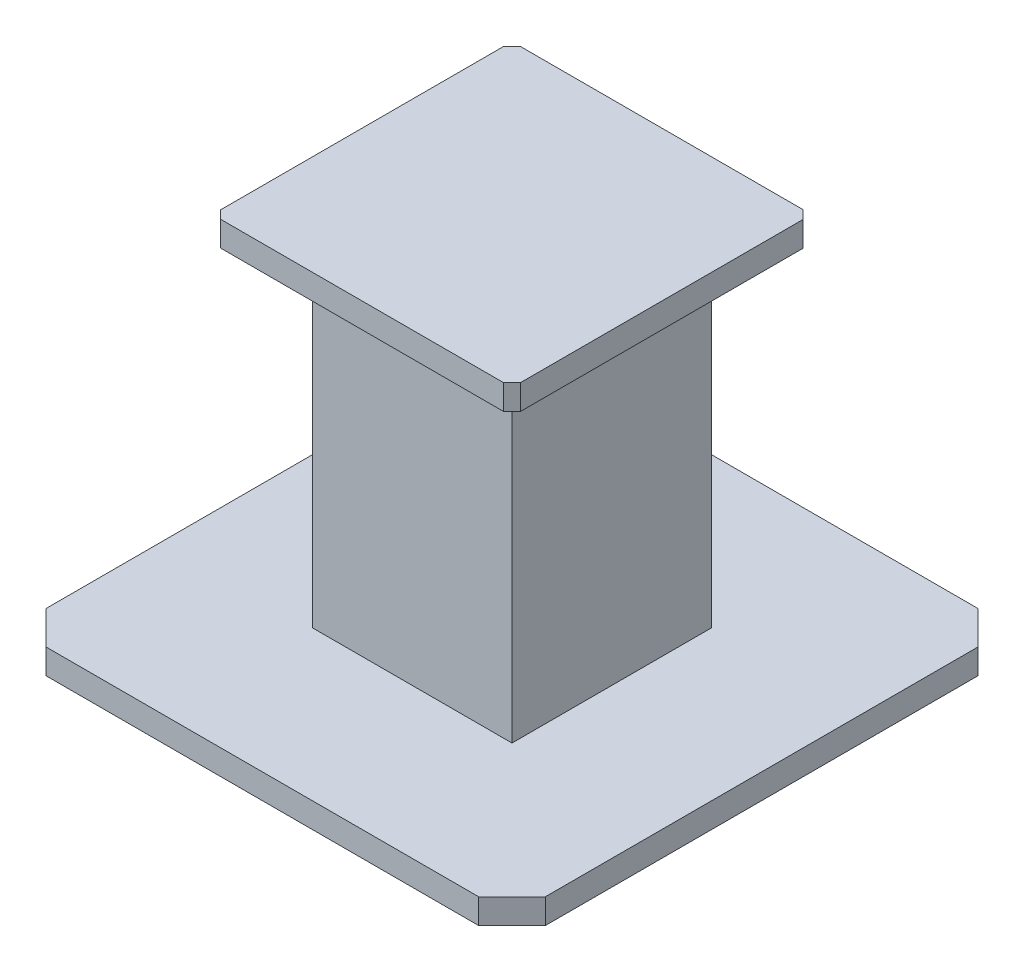
ISO-10303-21;
HEADER;
FILE_DESCRIPTION(('STEP AP214'),'2;1');
FILE_NAME('part.step','',(''),(''),'','','');
FILE_SCHEMA(('AUTOMOTIVE_DESIGN { 1 0 10303 214 1 1 1 1 }'));
ENDSEC;
DATA;
#1=APPLICATION_CONTEXT('core data for automotive mechanical design processes');
#2=APPLICATION_PROTOCOL_DEFINITION('international standard','automotive_design',2000,#1);
#3=PRODUCT_CONTEXT('',#1,'mechanical');
#4=PRODUCT('Part','Part','',(#3));
#5=PRODUCT_RELATED_PRODUCT_CATEGORY('part','',(#4));
#6=PRODUCT_DEFINITION_FORMATION('','',#4);
#7=PRODUCT_DEFINITION_CONTEXT('part definition',#1,'design');
#8=PRODUCT_DEFINITION('design','',#6,#7);
#9=PRODUCT_DEFINITION_SHAPE('','',#8);
#10=(LENGTH_UNIT() NAMED_UNIT(*) SI_UNIT(.MILLI.,.METRE.));
#11=(NAMED_UNIT(*) PLANE_ANGLE_UNIT() SI_UNIT($,.RADIAN.));
#12=(NAMED_UNIT(*) SI_UNIT($,.STERADIAN.) SOLID_ANGLE_UNIT());
#13=UNCERTAINTY_MEASURE_WITH_UNIT(LENGTH_MEASURE(1.E-05),#10,'distance_accuracy_value','');
#14=(GEOMETRIC_REPRESENTATION_CONTEXT(3) GLOBAL_UNCERTAINTY_ASSIGNED_CONTEXT((#13)) GLOBAL_UNIT_ASSIGNED_CONTEXT((#10,
#11,#12)) REPRESENTATION_CONTEXT('',''));
#15=CARTESIAN_POINT('',(0.,0.,0.));
#16=DIRECTION('',(0.,0.,1.));
#17=DIRECTION('',(1.,0.,0.));
#18=AXIS2_PLACEMENT_3D('',#15,#16,#17);
#19=CARTESIAN_POINT('',(0.,0.,0.));
#20=DIRECTION('',(0.,1.,0.));
#21=DIRECTION('',(0.,0.,1.));
#22=AXIS2_PLACEMENT_3D('',#19,#20,#21);
#23=PLANE('',#22);
#24=DIRECTION('',(0.,0.,1.));
#25=VECTOR('',#24,1.);
#26=CARTESIAN_POINT('',(-90.,0.,90.));
#27=LINE('',#26,#25);
#28=CARTESIAN_POINT('',(-90.,0.,-85.));
#29=VERTEX_POINT('',#28);
#30=CARTESIAN_POINT('',(-90.,0.,85.0000000000001));
#31=VERTEX_POINT('',#30);
#32=EDGE_CURVE('E218',#29,#31,#27,.T.);
#33=ORIENTED_EDGE('',*,*,#32,.F.);
#34=DIRECTION('',(-0.707106781186548,0.,0.707106781186548));
#35=VECTOR('',#34,1.);
#36=CARTESIAN_POINT('',(-90.,0.,-85.));
#37=LINE('',#36,#35);
#38=CARTESIAN_POINT('',(-85.,0.,-90.));
#39=VERTEX_POINT('',#38);
#40=EDGE_CURVE('E286',#29,#39,#37,.F.);
#41=ORIENTED_EDGE('',*,*,#40,.T.);
#42=DIRECTION('',(-1.,0.,0.));
#43=VECTOR('',#42,1.);
#44=CARTESIAN_POINT('',(90.,0.,-90.));
#45=LINE('',#44,#43);
#46=CARTESIAN_POINT('',(85.0000000000001,0.,-90.));
#47=VERTEX_POINT('',#46);
#48=EDGE_CURVE('E223',#47,#39,#45,.T.);
#49=ORIENTED_EDGE('',*,*,#48,.F.);
#50=DIRECTION('',(-0.707106781186546,0.,-0.707106781186549));
#51=VECTOR('',#50,1.);
#52=CARTESIAN_POINT('',(85.0000000000001,0.,-90.));
#53=LINE('',#52,#51);
#54=CARTESIAN_POINT('',(90.,0.,-85.));
#55=VERTEX_POINT('',#54);
#56=EDGE_CURVE('E284',#47,#55,#53,.F.);
#57=ORIENTED_EDGE('',*,*,#56,.T.);
#58=DIRECTION('',(0.,0.,-1.));
#59=VECTOR('',#58,1.);
#60=CARTESIAN_POINT('',(90.,0.,90.));
#61=LINE('',#60,#59);
#62=CARTESIAN_POINT('',(90.,0.,85.));
#63=VERTEX_POINT('',#62);
#64=EDGE_CURVE('E236',#63,#55,#61,.T.);
#65=ORIENTED_EDGE('',*,*,#64,.F.);
#66=DIRECTION('',(0.707106781186548,0.,-0.707106781186548));
#67=VECTOR('',#66,1.);
#68=CARTESIAN_POINT('',(90.,0.,85.));
#69=LINE('',#68,#67);
#70=CARTESIAN_POINT('',(85.0000000000001,0.,90.));
#71=VERTEX_POINT('',#70);
#72=EDGE_CURVE('E282',#63,#71,#69,.F.);
#73=ORIENTED_EDGE('',*,*,#72,.T.);
#74=DIRECTION('',(1.,0.,0.));
#75=VECTOR('',#74,1.);
#76=CARTESIAN_POINT('',(90.,0.,90.));
#77=LINE('',#76,#75);
#78=CARTESIAN_POINT('',(-85.,0.,90.));
#79=VERTEX_POINT('',#78);
#80=EDGE_CURVE('E233',#79,#71,#77,.T.);
#81=ORIENTED_EDGE('',*,*,#80,.F.);
#82=DIRECTION('',(0.707106781186549,0.,0.707106781186546));
#83=VECTOR('',#82,1.);
#84=CARTESIAN_POINT('',(-85.,0.,90.));
#85=LINE('',#84,#83);
#86=EDGE_CURVE('E280',#79,#31,#85,.F.);
#87=ORIENTED_EDGE('',*,*,#86,.T.);
#88=EDGE_LOOP('',(#33,#41,#49,#57,#65,#73,#81,#87));
#89=FACE_BOUND('',#88,.T.);
#90=DIRECTION('',(0.,0.,-1.));
#91=VECTOR('',#90,1.);
#92=CARTESIAN_POINT('',(-60.,0.,-60.));
#93=LINE('',#92,#91);
#94=CARTESIAN_POINT('',(-60.,0.,60.));
#95=VERTEX_POINT('',#94);
#96=CARTESIAN_POINT('',(-60.,0.,-60.));
#97=VERTEX_POINT('',#96);
#98=EDGE_CURVE('E203',#95,#97,#93,.T.);
#99=ORIENTED_EDGE('',*,*,#98,.F.);
#100=DIRECTION('',(-1.,0.,0.));
#101=VECTOR('',#100,1.);
#102=CARTESIAN_POINT('',(60.,0.,60.));
#103=LINE('',#102,#101);
#104=CARTESIAN_POINT('',(60.,0.,60.));
#105=VERTEX_POINT('',#104);
#106=EDGE_CURVE('E185',#105,#95,#103,.T.);
#107=ORIENTED_EDGE('',*,*,#106,.F.);
#108=DIRECTION('',(0.,0.,1.));
#109=VECTOR('',#108,1.);
#110=CARTESIAN_POINT('',(60.,0.,-60.));
#111=LINE('',#110,#109);
#112=CARTESIAN_POINT('',(60.,0.,-60.));
#113=VERTEX_POINT('',#112);
#114=EDGE_CURVE('E209',#113,#105,#111,.T.);
#115=ORIENTED_EDGE('',*,*,#114,.F.);
#116=DIRECTION('',(1.,0.,0.));
#117=VECTOR('',#116,1.);
#118=CARTESIAN_POINT('',(60.,0.,-60.));
#119=LINE('',#118,#117);
#120=EDGE_CURVE('E205',#97,#113,#119,.T.);
#121=ORIENTED_EDGE('',*,*,#120,.F.);
#122=EDGE_LOOP('',(#99,#107,#115,#121));
#123=FACE_BOUND('',#122,.T.);
#124=ADVANCED_FACE('F35',(#89,#123),#23,.F.);
#125=CARTESIAN_POINT('',(-90.,15.,90.));
#126=DIRECTION('',(1.,0.,0.));
#127=DIRECTION('',(0.,0.,-1.));
#128=AXIS2_PLACEMENT_3D('',#125,#126,#127);
#129=PLANE('',#128);
#130=DIRECTION('',(0.,0.,1.));
#131=VECTOR('',#130,1.);
#132=CARTESIAN_POINT('',(-90.,15.,90.));
#133=LINE('',#132,#131);
#134=CARTESIAN_POINT('',(-90.,15.,-85.));
#135=VERTEX_POINT('',#134);
#136=CARTESIAN_POINT('',(-90.,15.,85.0000000000001));
#137=VERTEX_POINT('',#136);
#138=EDGE_CURVE('E219',#135,#137,#133,.T.);
#139=ORIENTED_EDGE('',*,*,#138,.F.);
#140=DIRECTION('',(0.,-1.,0.));
#141=VECTOR('',#140,1.);
#142=CARTESIAN_POINT('',(-90.,15.,-85.));
#143=LINE('',#142,#141);
#144=EDGE_CURVE('E277',#135,#29,#143,.T.);
#145=ORIENTED_EDGE('',*,*,#144,.T.);
#146=ORIENTED_EDGE('',*,*,#32,.T.);
#147=DIRECTION('',(0.,1.,0.));
#148=VECTOR('',#147,1.);
#149=CARTESIAN_POINT('',(-90.,15.,85.0000000000001));
#150=LINE('',#149,#148);
#151=EDGE_CURVE('E275',#31,#137,#150,.T.);
#152=ORIENTED_EDGE('',*,*,#151,.T.);
#153=EDGE_LOOP('',(#139,#145,#146,#152));
#154=FACE_BOUND('',#153,.T.);
#155=ADVANCED_FACE('F336',(#154),#129,.F.);
#156=CARTESIAN_POINT('',(90.,15.,90.));
#157=DIRECTION('',(0.,0.,-1.));
#158=DIRECTION('',(-1.,0.,0.));
#159=AXIS2_PLACEMENT_3D('',#156,#157,#158);
#160=PLANE('',#159);
#161=ORIENTED_EDGE('',*,*,#80,.T.);
#162=DIRECTION('',(0.,1.,0.));
#163=VECTOR('',#162,1.);
#164=CARTESIAN_POINT('',(85.0000000000001,15.,90.));
#165=LINE('',#164,#163);
#166=CARTESIAN_POINT('',(85.0000000000001,15.,90.));
#167=VERTEX_POINT('',#166);
#168=EDGE_CURVE('E11',#71,#167,#165,.T.);
#169=ORIENTED_EDGE('',*,*,#168,.T.);
#170=DIRECTION('',(1.,0.,0.));
#171=VECTOR('',#170,1.);
#172=CARTESIAN_POINT('',(90.,15.,90.));
#173=LINE('',#172,#171);
#174=CARTESIAN_POINT('',(-85.,15.,90.));
#175=VERTEX_POINT('',#174);
#176=EDGE_CURVE('E222',#175,#167,#173,.T.);
#177=ORIENTED_EDGE('',*,*,#176,.F.);
#178=DIRECTION('',(0.,-1.,0.));
#179=VECTOR('',#178,1.);
#180=CARTESIAN_POINT('',(-85.,15.,90.));
#181=LINE('',#180,#179);
#182=EDGE_CURVE('E43',#175,#79,#181,.T.);
#183=ORIENTED_EDGE('',*,*,#182,.T.);
#184=EDGE_LOOP('',(#161,#169,#177,#183));
#185=FACE_BOUND('',#184,.T.);
#186=ADVANCED_FACE('F308',(#185),#160,.F.);
#187=CARTESIAN_POINT('',(90.,15.,90.));
#188=DIRECTION('',(-1.,0.,0.));
#189=DIRECTION('',(0.,0.,1.));
#190=AXIS2_PLACEMENT_3D('',#187,#188,#189);
#191=PLANE('',#190);
#192=ORIENTED_EDGE('',*,*,#64,.T.);
#193=DIRECTION('',(0.,1.,0.));
#194=VECTOR('',#193,1.);
#195=CARTESIAN_POINT('',(90.,15.,-85.0000000000001));
#196=LINE('',#195,#194);
#197=CARTESIAN_POINT('',(90.,15.,-85.));
#198=VERTEX_POINT('',#197);
#199=EDGE_CURVE('E50',#55,#198,#196,.T.);
#200=ORIENTED_EDGE('',*,*,#199,.T.);
#201=DIRECTION('',(0.,0.,-1.));
#202=VECTOR('',#201,1.);
#203=CARTESIAN_POINT('',(90.,15.,90.));
#204=LINE('',#203,#202);
#205=CARTESIAN_POINT('',(90.,15.,85.));
#206=VERTEX_POINT('',#205);
#207=EDGE_CURVE('E225',#206,#198,#204,.T.);
#208=ORIENTED_EDGE('',*,*,#207,.F.);
#209=DIRECTION('',(0.,-1.,0.));
#210=VECTOR('',#209,1.);
#211=CARTESIAN_POINT('',(90.,15.,85.));
#212=LINE('',#211,#210);
#213=EDGE_CURVE('E300',#206,#63,#212,.T.);
#214=ORIENTED_EDGE('',*,*,#213,.T.);
#215=EDGE_LOOP('',(#192,#200,#208,#214));
#216=FACE_BOUND('',#215,.T.);
#217=ADVANCED_FACE('F319',(#216),#191,.F.);
#218=CARTESIAN_POINT('',(90.,15.,-90.));
#219=DIRECTION('',(0.,0.,1.));
#220=DIRECTION('',(1.,0.,0.));
#221=AXIS2_PLACEMENT_3D('',#218,#219,#220);
#222=PLANE('',#221);
#223=ORIENTED_EDGE('',*,*,#48,.T.);
#224=DIRECTION('',(0.,1.,0.));
#225=VECTOR('',#224,1.);
#226=CARTESIAN_POINT('',(-85.,15.,-90.));
#227=LINE('',#226,#225);
#228=CARTESIAN_POINT('',(-85.,15.,-90.));
#229=VERTEX_POINT('',#228);
#230=EDGE_CURVE('E291',#39,#229,#227,.T.);
#231=ORIENTED_EDGE('',*,*,#230,.T.);
#232=DIRECTION('',(-1.,0.,0.));
#233=VECTOR('',#232,1.);
#234=CARTESIAN_POINT('',(90.,15.,-90.));
#235=LINE('',#234,#233);
#236=CARTESIAN_POINT('',(85.0000000000001,15.,-90.));
#237=VERTEX_POINT('',#236);
#238=EDGE_CURVE('E227',#237,#229,#235,.T.);
#239=ORIENTED_EDGE('',*,*,#238,.F.);
#240=DIRECTION('',(0.,-1.,0.));
#241=VECTOR('',#240,1.);
#242=CARTESIAN_POINT('',(85.0000000000001,15.,-90.));
#243=LINE('',#242,#241);
#244=EDGE_CURVE('E288',#237,#47,#243,.T.);
#245=ORIENTED_EDGE('',*,*,#244,.T.);
#246=EDGE_LOOP('',(#223,#231,#239,#245));
#247=FACE_BOUND('',#246,.T.);
#248=ADVANCED_FACE('F328',(#247),#222,.F.);
#249=CARTESIAN_POINT('',(0.,15.,0.));
#250=DIRECTION('',(0.,1.,0.));
#251=DIRECTION('',(0.,0.,1.));
#252=AXIS2_PLACEMENT_3D('',#249,#250,#251);
#253=PLANE('',#252);
#254=ORIENTED_EDGE('',*,*,#238,.T.);
#255=DIRECTION('',(0.707106781186548,0.,-0.707106781186548));
#256=VECTOR('',#255,1.);
#257=CARTESIAN_POINT('',(-87.5,15.,-87.5));
#258=LINE('',#257,#256);
#259=EDGE_CURVE('E298',#229,#135,#258,.F.);
#260=ORIENTED_EDGE('',*,*,#259,.T.);
#261=ORIENTED_EDGE('',*,*,#138,.T.);
#262=DIRECTION('',(-0.707106781186549,0.,-0.707106781186546));
#263=VECTOR('',#262,1.);
#264=CARTESIAN_POINT('',(-87.4999999999998,15.,87.5000000000003));
#265=LINE('',#264,#263);
#266=EDGE_CURVE('E293',#137,#175,#265,.F.);
#267=ORIENTED_EDGE('',*,*,#266,.T.);
#268=ORIENTED_EDGE('',*,*,#176,.T.);
#269=DIRECTION('',(-0.707106781186548,0.,0.707106781186548));
#270=VECTOR('',#269,1.);
#271=CARTESIAN_POINT('',(87.5,15.,87.5));
#272=LINE('',#271,#270);
#273=EDGE_CURVE('E57',#167,#206,#272,.F.);
#274=ORIENTED_EDGE('',*,*,#273,.T.);
#275=ORIENTED_EDGE('',*,*,#207,.T.);
#276=DIRECTION('',(0.707106781186546,0.,0.707106781186549));
#277=VECTOR('',#276,1.);
#278=CARTESIAN_POINT('',(87.5000000000003,15.,-87.4999999999998));
#279=LINE('',#278,#277);
#280=EDGE_CURVE('E296',#198,#237,#279,.F.);
#281=ORIENTED_EDGE('',*,*,#280,.T.);
#282=EDGE_LOOP('',(#254,#260,#261,#267,#268,#274,#275,#281));
#283=FACE_BOUND('',#282,.T.);
#284=ADVANCED_FACE('F321',(#283),#253,.T.);
#285=CARTESIAN_POINT('',(-60.,-200.,-60.));
#286=DIRECTION('',(1.,0.,0.));
#287=DIRECTION('',(0.,0.,-1.));
#288=AXIS2_PLACEMENT_3D('',#285,#286,#287);
#289=PLANE('',#288);
#290=ORIENTED_EDGE('',*,*,#98,.T.);
#291=DIRECTION('',(0.,1.,0.));
#292=VECTOR('',#291,1.);
#293=CARTESIAN_POINT('',(-60.,-200.,-60.));
#294=LINE('',#293,#292);
#295=CARTESIAN_POINT('',(-60.,-200.,-60.));
#296=VERTEX_POINT('',#295);
#297=EDGE_CURVE('E180',#296,#97,#294,.T.);
#298=ORIENTED_EDGE('',*,*,#297,.F.);
#299=DIRECTION('',(0.,0.,-1.));
#300=VECTOR('',#299,1.);
#301=CARTESIAN_POINT('',(-60.,-200.,-60.));
#302=LINE('',#301,#300);
#303=CARTESIAN_POINT('',(-60.,-200.,60.));
#304=VERTEX_POINT('',#303);
#305=EDGE_CURVE('E174',#304,#296,#302,.T.);
#306=ORIENTED_EDGE('',*,*,#305,.F.);
#307=DIRECTION('',(0.,1.,0.));
#308=VECTOR('',#307,1.);
#309=CARTESIAN_POINT('',(-60.,-200.,60.));
#310=LINE('',#309,#308);
#311=EDGE_CURVE('E178',#304,#95,#310,.T.);
#312=ORIENTED_EDGE('',*,*,#311,.T.);
#313=EDGE_LOOP('',(#290,#298,#306,#312));
#314=FACE_BOUND('',#313,.T.);
#315=ADVANCED_FACE('F177',(#314),#289,.F.);
#316=CARTESIAN_POINT('',(60.,-200.,-60.));
#317=DIRECTION('',(0.,0.,1.));
#318=DIRECTION('',(1.,0.,0.));
#319=AXIS2_PLACEMENT_3D('',#316,#317,#318);
#320=PLANE('',#319);
#321=ORIENTED_EDGE('',*,*,#120,.T.);
#322=DIRECTION('',(0.,1.,0.));
#323=VECTOR('',#322,1.);
#324=CARTESIAN_POINT('',(60.,-200.,-60.));
#325=LINE('',#324,#323);
#326=CARTESIAN_POINT('',(60.,-200.,-60.));
#327=VERTEX_POINT('',#326);
#328=EDGE_CURVE('E214',#327,#113,#325,.T.);
#329=ORIENTED_EDGE('',*,*,#328,.F.);
#330=DIRECTION('',(1.,0.,0.));
#331=VECTOR('',#330,1.);
#332=CARTESIAN_POINT('',(60.,-200.,-60.));
#333=LINE('',#332,#331);
#334=EDGE_CURVE('E184',#296,#327,#333,.T.);
#335=ORIENTED_EDGE('',*,*,#334,.F.);
#336=ORIENTED_EDGE('',*,*,#297,.T.);
#337=EDGE_LOOP('',(#321,#329,#335,#336));
#338=FACE_BOUND('',#337,.T.);
#339=ADVANCED_FACE('F486',(#338),#320,.F.);
#340=CARTESIAN_POINT('',(60.,-200.,-60.));
#341=DIRECTION('',(-1.,0.,0.));
#342=DIRECTION('',(0.,0.,1.));
#343=AXIS2_PLACEMENT_3D('',#340,#341,#342);
#344=PLANE('',#343);
#345=ORIENTED_EDGE('',*,*,#114,.T.);
#346=DIRECTION('',(0.,1.,0.));
#347=VECTOR('',#346,1.);
#348=CARTESIAN_POINT('',(60.,-200.,60.));
#349=LINE('',#348,#347);
#350=CARTESIAN_POINT('',(60.,-200.,60.));
#351=VERTEX_POINT('',#350);
#352=EDGE_CURVE('E194',#351,#105,#349,.T.);
#353=ORIENTED_EDGE('',*,*,#352,.F.);
#354=DIRECTION('',(0.,0.,1.));
#355=VECTOR('',#354,1.);
#356=CARTESIAN_POINT('',(60.,-200.,-60.));
#357=LINE('',#356,#355);
#358=EDGE_CURVE('E198',#327,#351,#357,.T.);
#359=ORIENTED_EDGE('',*,*,#358,.F.);
#360=ORIENTED_EDGE('',*,*,#328,.T.);
#361=EDGE_LOOP('',(#345,#353,#359,#360));
#362=FACE_BOUND('',#361,.T.);
#363=ADVANCED_FACE('F478',(#362),#344,.F.);
#364=CARTESIAN_POINT('',(60.,-200.,60.));
#365=DIRECTION('',(0.,0.,-1.));
#366=DIRECTION('',(-1.,0.,0.));
#367=AXIS2_PLACEMENT_3D('',#364,#365,#366);
#368=PLANE('',#367);
#369=ORIENTED_EDGE('',*,*,#106,.T.);
#370=ORIENTED_EDGE('',*,*,#311,.F.);
#371=DIRECTION('',(-1.,0.,0.));
#372=VECTOR('',#371,1.);
#373=CARTESIAN_POINT('',(60.,-200.,60.));
#374=LINE('',#373,#372);
#375=EDGE_CURVE('E192',#351,#304,#374,.T.);
#376=ORIENTED_EDGE('',*,*,#375,.F.);
#377=ORIENTED_EDGE('',*,*,#352,.T.);
#378=EDGE_LOOP('',(#369,#370,#376,#377));
#379=FACE_BOUND('',#378,.T.);
#380=ADVANCED_FACE('F190',(#379),#368,.F.);
#381=CARTESIAN_POINT('',(0.,-200.,0.));
#382=DIRECTION('',(0.,-1.,0.));
#383=DIRECTION('',(0.,0.,-1.));
#384=AXIS2_PLACEMENT_3D('',#381,#382,#383);
#385=PLANE('',#384);
#386=DIRECTION('',(0.,0.,1.));
#387=VECTOR('',#386,1.);
#388=CARTESIAN_POINT('',(150.,-200.,-150.));
#389=LINE('',#388,#387);
#390=CARTESIAN_POINT('',(150.,-200.,-130.));
#391=VERTEX_POINT('',#390);
#392=CARTESIAN_POINT('',(150.,-200.,130.));
#393=VERTEX_POINT('',#392);
#394=EDGE_CURVE('E556',#391,#393,#389,.T.);
#395=ORIENTED_EDGE('',*,*,#394,.F.);
#396=DIRECTION('',(0.707106781186548,0.,0.707106781186547));
#397=VECTOR('',#396,1.);
#398=CARTESIAN_POINT('',(150.,-200.,-130.));
#399=LINE('',#398,#397);
#400=CARTESIAN_POINT('',(130.,-200.,-150.));
#401=VERTEX_POINT('',#400);
#402=EDGE_CURVE('E250',#391,#401,#399,.F.);
#403=ORIENTED_EDGE('',*,*,#402,.T.);
#404=DIRECTION('',(1.,0.,0.));
#405=VECTOR('',#404,1.);
#406=CARTESIAN_POINT('',(150.,-200.,-150.));
#407=LINE('',#406,#405);
#408=CARTESIAN_POINT('',(-130.,-200.,-150.));
#409=VERTEX_POINT('',#408);
#410=EDGE_CURVE('E559',#409,#401,#407,.T.);
#411=ORIENTED_EDGE('',*,*,#410,.F.);
#412=DIRECTION('',(0.707106781186547,0.,-0.707106781186549));
#413=VECTOR('',#412,1.);
#414=CARTESIAN_POINT('',(-130.,-200.,-150.));
#415=LINE('',#414,#413);
#416=CARTESIAN_POINT('',(-150.,-200.,-130.));
#417=VERTEX_POINT('',#416);
#418=EDGE_CURVE('E244',#409,#417,#415,.F.);
#419=ORIENTED_EDGE('',*,*,#418,.T.);
#420=DIRECTION('',(0.,0.,-1.));
#421=VECTOR('',#420,1.);
#422=CARTESIAN_POINT('',(-150.,-200.,-150.));
#423=LINE('',#422,#421);
#424=CARTESIAN_POINT('',(-150.,-200.,130.));
#425=VERTEX_POINT('',#424);
#426=EDGE_CURVE('E562',#425,#417,#423,.T.);
#427=ORIENTED_EDGE('',*,*,#426,.F.);
#428=DIRECTION('',(-0.70710678118655,0.,-0.707106781186546));
#429=VECTOR('',#428,1.);
#430=CARTESIAN_POINT('',(-150.,-200.,130.));
#431=LINE('',#430,#429);
#432=CARTESIAN_POINT('',(-130.,-200.,150.));
#433=VERTEX_POINT('',#432);
#434=EDGE_CURVE('E246',#425,#433,#431,.F.);
#435=ORIENTED_EDGE('',*,*,#434,.T.);
#436=DIRECTION('',(-1.,0.,0.));
#437=VECTOR('',#436,1.);
#438=CARTESIAN_POINT('',(150.,-200.,150.));
#439=LINE('',#438,#437);
#440=CARTESIAN_POINT('',(130.,-200.,150.));
#441=VERTEX_POINT('',#440);
#442=EDGE_CURVE('E552',#441,#433,#439,.T.);
#443=ORIENTED_EDGE('',*,*,#442,.F.);
#444=DIRECTION('',(-0.707106781186546,0.,0.70710678118655));
#445=VECTOR('',#444,1.);
#446=CARTESIAN_POINT('',(130.,-200.,150.));
#447=LINE('',#446,#445);
#448=EDGE_CURVE('E248',#441,#393,#447,.F.);
#449=ORIENTED_EDGE('',*,*,#448,.T.);
#450=EDGE_LOOP('',(#395,#403,#411,#419,#427,#435,#443,#449));
#451=FACE_BOUND('',#450,.T.);
#452=ORIENTED_EDGE('',*,*,#375,.T.);
#453=ORIENTED_EDGE('',*,*,#305,.T.);
#454=ORIENTED_EDGE('',*,*,#334,.T.);
#455=ORIENTED_EDGE('',*,*,#358,.T.);
#456=EDGE_LOOP('',(#452,#453,#454,#455));
#457=FACE_BOUND('',#456,.T.);
#458=ADVANCED_FACE('F196',(#451,#457),#385,.F.);
#459=CARTESIAN_POINT('',(-150.,-215.,-150.));
#460=DIRECTION('',(1.,0.,0.));
#461=DIRECTION('',(0.,0.,-1.));
#462=AXIS2_PLACEMENT_3D('',#459,#460,#461);
#463=PLANE('',#462);
#464=DIRECTION('',(0.,0.,-1.));
#465=VECTOR('',#464,1.);
#466=CARTESIAN_POINT('',(-150.,-215.,-150.));
#467=LINE('',#466,#465);
#468=CARTESIAN_POINT('',(-150.,-215.,130.));
#469=VERTEX_POINT('',#468);
#470=CARTESIAN_POINT('',(-150.,-215.,-130.));
#471=VERTEX_POINT('',#470);
#472=EDGE_CURVE('E555',#469,#471,#467,.T.);
#473=ORIENTED_EDGE('',*,*,#472,.F.);
#474=DIRECTION('',(0.,1.,0.));
#475=VECTOR('',#474,1.);
#476=CARTESIAN_POINT('',(-150.,-215.,130.));
#477=LINE('',#476,#475);
#478=EDGE_CURVE('E272',#469,#425,#477,.T.);
#479=ORIENTED_EDGE('',*,*,#478,.T.);
#480=ORIENTED_EDGE('',*,*,#426,.T.);
#481=DIRECTION('',(0.,-1.,0.));
#482=VECTOR('',#481,1.);
#483=CARTESIAN_POINT('',(-150.,-215.,-130.));
#484=LINE('',#483,#482);
#485=EDGE_CURVE('E270',#417,#471,#484,.T.);
#486=ORIENTED_EDGE('',*,*,#485,.T.);
#487=EDGE_LOOP('',(#473,#479,#480,#486));
#488=FACE_BOUND('',#487,.T.);
#489=ADVANCED_FACE('F453',(#488),#463,.F.);
#490=CARTESIAN_POINT('',(150.,-215.,-150.));
#491=DIRECTION('',(0.,0.,1.));
#492=DIRECTION('',(1.,0.,0.));
#493=AXIS2_PLACEMENT_3D('',#490,#491,#492);
#494=PLANE('',#493);
#495=ORIENTED_EDGE('',*,*,#410,.T.);
#496=DIRECTION('',(0.,-1.,0.));
#497=VECTOR('',#496,1.);
#498=CARTESIAN_POINT('',(130.,-215.,-150.));
#499=LINE('',#498,#497);
#500=CARTESIAN_POINT('',(130.,-215.,-150.));
#501=VERTEX_POINT('',#500);
#502=EDGE_CURVE('E255',#401,#501,#499,.T.);
#503=ORIENTED_EDGE('',*,*,#502,.T.);
#504=DIRECTION('',(1.,0.,0.));
#505=VECTOR('',#504,1.);
#506=CARTESIAN_POINT('',(150.,-215.,-150.));
#507=LINE('',#506,#505);
#508=CARTESIAN_POINT('',(-130.,-215.,-150.));
#509=VERTEX_POINT('',#508);
#510=EDGE_CURVE('E570',#509,#501,#507,.T.);
#511=ORIENTED_EDGE('',*,*,#510,.F.);
#512=DIRECTION('',(0.,1.,0.));
#513=VECTOR('',#512,1.);
#514=CARTESIAN_POINT('',(-130.,-215.,-150.));
#515=LINE('',#514,#513);
#516=EDGE_CURVE('E252',#509,#409,#515,.T.);
#517=ORIENTED_EDGE('',*,*,#516,.T.);
#518=EDGE_LOOP('',(#495,#503,#511,#517));
#519=FACE_BOUND('',#518,.T.);
#520=ADVANCED_FACE('F444',(#519),#494,.F.);
#521=CARTESIAN_POINT('',(150.,-215.,-150.));
#522=DIRECTION('',(-1.,0.,0.));
#523=DIRECTION('',(0.,0.,1.));
#524=AXIS2_PLACEMENT_3D('',#521,#522,#523);
#525=PLANE('',#524);
#526=DIRECTION('',(0.,0.,1.));
#527=VECTOR('',#526,1.);
#528=CARTESIAN_POINT('',(150.,-215.,-150.));
#529=LINE('',#528,#527);
#530=CARTESIAN_POINT('',(150.,-215.,-130.));
#531=VERTEX_POINT('',#530);
#532=CARTESIAN_POINT('',(150.,-215.,130.));
#533=VERTEX_POINT('',#532);
#534=EDGE_CURVE('E567',#531,#533,#529,.T.);
#535=ORIENTED_EDGE('',*,*,#534,.F.);
#536=DIRECTION('',(0.,1.,0.));
#537=VECTOR('',#536,1.);
#538=CARTESIAN_POINT('',(150.,-215.,-130.));
#539=LINE('',#538,#537);
#540=EDGE_CURVE('E241',#531,#391,#539,.T.);
#541=ORIENTED_EDGE('',*,*,#540,.T.);
#542=ORIENTED_EDGE('',*,*,#394,.T.);
#543=DIRECTION('',(0.,-1.,0.));
#544=VECTOR('',#543,1.);
#545=CARTESIAN_POINT('',(150.,-215.,130.));
#546=LINE('',#545,#544);
#547=EDGE_CURVE('E230',#393,#533,#546,.T.);
#548=ORIENTED_EDGE('',*,*,#547,.T.);
#549=EDGE_LOOP('',(#535,#541,#542,#548));
#550=FACE_BOUND('',#549,.T.);
#551=ADVANCED_FACE('F435',(#550),#525,.F.);
#552=CARTESIAN_POINT('',(150.,-215.,150.));
#553=DIRECTION('',(0.,0.,-1.));
#554=DIRECTION('',(-1.,0.,0.));
#555=AXIS2_PLACEMENT_3D('',#552,#553,#554);
#556=PLANE('',#555);
#557=DIRECTION('',(-1.,0.,0.));
#558=VECTOR('',#557,1.);
#559=CARTESIAN_POINT('',(150.,-215.,150.));
#560=LINE('',#559,#558);
#561=CARTESIAN_POINT('',(130.,-215.,150.));
#562=VERTEX_POINT('',#561);
#563=CARTESIAN_POINT('',(-130.,-215.,150.));
#564=VERTEX_POINT('',#563);
#565=EDGE_CURVE('E206',#562,#564,#560,.T.);
#566=ORIENTED_EDGE('',*,*,#565,.F.);
#567=DIRECTION('',(0.,1.,0.));
#568=VECTOR('',#567,1.);
#569=CARTESIAN_POINT('',(130.,-215.,150.));
#570=LINE('',#569,#568);
#571=EDGE_CURVE('E267',#562,#441,#570,.T.);
#572=ORIENTED_EDGE('',*,*,#571,.T.);
#573=ORIENTED_EDGE('',*,*,#442,.T.);
#574=DIRECTION('',(0.,-1.,0.));
#575=VECTOR('',#574,1.);
#576=CARTESIAN_POINT('',(-130.,-215.,150.));
#577=LINE('',#576,#575);
#578=EDGE_CURVE('E265',#433,#564,#577,.T.);
#579=ORIENTED_EDGE('',*,*,#578,.T.);
#580=EDGE_LOOP('',(#566,#572,#573,#579));
#581=FACE_BOUND('',#580,.T.);
#582=ADVANCED_FACE('F426',(#581),#556,.F.);
#583=CARTESIAN_POINT('',(0.,-215.,0.));
#584=DIRECTION('',(0.,-1.,0.));
#585=DIRECTION('',(0.,0.,-1.));
#586=AXIS2_PLACEMENT_3D('',#583,#584,#585);
#587=PLANE('',#586);
#588=ORIENTED_EDGE('',*,*,#510,.T.);
#589=DIRECTION('',(-0.707106781186548,0.,-0.707106781186547));
#590=VECTOR('',#589,1.);
#591=CARTESIAN_POINT('',(140.,-215.,-140.));
#592=LINE('',#591,#590);
#593=EDGE_CURVE('E263',#501,#531,#592,.F.);
#594=ORIENTED_EDGE('',*,*,#593,.T.);
#595=ORIENTED_EDGE('',*,*,#534,.T.);
#596=DIRECTION('',(0.707106781186546,0.,-0.70710678118655));
#597=VECTOR('',#596,1.);
#598=CARTESIAN_POINT('',(140.,-215.,140.));
#599=LINE('',#598,#597);
#600=EDGE_CURVE('E261',#533,#562,#599,.F.);
#601=ORIENTED_EDGE('',*,*,#600,.T.);
#602=ORIENTED_EDGE('',*,*,#565,.T.);
#603=DIRECTION('',(0.70710678118655,0.,0.707106781186546));
#604=VECTOR('',#603,1.);
#605=CARTESIAN_POINT('',(-140.,-215.,140.));
#606=LINE('',#605,#604);
#607=EDGE_CURVE('E259',#564,#469,#606,.F.);
#608=ORIENTED_EDGE('',*,*,#607,.T.);
#609=ORIENTED_EDGE('',*,*,#472,.T.);
#610=DIRECTION('',(-0.707106781186547,0.,0.707106781186549));
#611=VECTOR('',#610,1.);
#612=CARTESIAN_POINT('',(-140.,-215.,-140.));
#613=LINE('',#612,#611);
#614=EDGE_CURVE('E257',#471,#509,#613,.F.);
#615=ORIENTED_EDGE('',*,*,#614,.T.);
#616=EDGE_LOOP('',(#588,#594,#595,#601,#602,#608,#609,#615));
#617=FACE_BOUND('',#616,.T.);
#618=ADVANCED_FACE('F361',(#617),#587,.T.);
#619=CARTESIAN_POINT('',(150.,-215.,-130.));
#620=DIRECTION('',(-0.707106781186547,0.,0.707106781186548));
#621=DIRECTION('',(0.,1.,0.));
#622=AXIS2_PLACEMENT_3D('',#619,#620,#621);
#623=PLANE('',#622);
#624=ORIENTED_EDGE('',*,*,#593,.F.);
#625=ORIENTED_EDGE('',*,*,#502,.F.);
#626=ORIENTED_EDGE('',*,*,#402,.F.);
#627=ORIENTED_EDGE('',*,*,#540,.F.);
#628=EDGE_LOOP('',(#624,#625,#626,#627));
#629=FACE_BOUND('',#628,.T.);
#630=ADVANCED_FACE('F357',(#629),#623,.F.);
#631=CARTESIAN_POINT('',(130.,-215.,150.));
#632=DIRECTION('',(-0.707106781186549,0.,-0.707106781186545));
#633=DIRECTION('',(0.,1.,0.));
#634=AXIS2_PLACEMENT_3D('',#631,#632,#633);
#635=PLANE('',#634);
#636=ORIENTED_EDGE('',*,*,#600,.F.);
#637=ORIENTED_EDGE('',*,*,#547,.F.);
#638=ORIENTED_EDGE('',*,*,#448,.F.);
#639=ORIENTED_EDGE('',*,*,#571,.F.);
#640=EDGE_LOOP('',(#636,#637,#638,#639));
#641=FACE_BOUND('',#640,.T.);
#642=ADVANCED_FACE('F360',(#641),#635,.F.);
#643=CARTESIAN_POINT('',(-150.,-215.,130.));
#644=DIRECTION('',(0.707106781186545,0.,-0.707106781186549));
#645=DIRECTION('',(0.,1.,0.));
#646=AXIS2_PLACEMENT_3D('',#643,#644,#645);
#647=PLANE('',#646);
#648=ORIENTED_EDGE('',*,*,#607,.F.);
#649=ORIENTED_EDGE('',*,*,#578,.F.);
#650=ORIENTED_EDGE('',*,*,#434,.F.);
#651=ORIENTED_EDGE('',*,*,#478,.F.);
#652=EDGE_LOOP('',(#648,#649,#650,#651));
#653=FACE_BOUND('',#652,.T.);
#654=ADVANCED_FACE('F365',(#653),#647,.F.);
#655=CARTESIAN_POINT('',(-130.,-215.,-150.));
#656=DIRECTION('',(0.707106781186548,0.,0.707106781186546));
#657=DIRECTION('',(0.,1.,0.));
#658=AXIS2_PLACEMENT_3D('',#655,#656,#657);
#659=PLANE('',#658);
#660=ORIENTED_EDGE('',*,*,#614,.F.);
#661=ORIENTED_EDGE('',*,*,#485,.F.);
#662=ORIENTED_EDGE('',*,*,#418,.F.);
#663=ORIENTED_EDGE('',*,*,#516,.F.);
#664=EDGE_LOOP('',(#660,#661,#662,#663));
#665=FACE_BOUND('',#664,.T.);
#666=ADVANCED_FACE('F369',(#665),#659,.F.);
#667=CARTESIAN_POINT('',(-90.,15.,-85.));
#668=DIRECTION('',(0.707106781186547,0.,0.707106781186547));
#669=DIRECTION('',(0.,-1.,0.));
#670=AXIS2_PLACEMENT_3D('',#667,#668,#669);
#671=PLANE('',#670);
#672=ORIENTED_EDGE('',*,*,#259,.F.);
#673=ORIENTED_EDGE('',*,*,#230,.F.);
#674=ORIENTED_EDGE('',*,*,#40,.F.);
#675=ORIENTED_EDGE('',*,*,#144,.F.);
#676=EDGE_LOOP('',(#672,#673,#674,#675));
#677=FACE_BOUND('',#676,.T.);
#678=ADVANCED_FACE('F333',(#677),#671,.F.);
#679=CARTESIAN_POINT('',(85.0000000000001,15.,-90.));
#680=DIRECTION('',(-0.707106781186549,0.,0.707106781186546));
#681=DIRECTION('',(0.,-1.,0.));
#682=AXIS2_PLACEMENT_3D('',#679,#680,#681);
#683=PLANE('',#682);
#684=ORIENTED_EDGE('',*,*,#280,.F.);
#685=ORIENTED_EDGE('',*,*,#199,.F.);
#686=ORIENTED_EDGE('',*,*,#56,.F.);
#687=ORIENTED_EDGE('',*,*,#244,.F.);
#688=EDGE_LOOP('',(#684,#685,#686,#687));
#689=FACE_BOUND('',#688,.T.);
#690=ADVANCED_FACE('F325',(#689),#683,.F.);
#691=CARTESIAN_POINT('',(90.,15.,85.));
#692=DIRECTION('',(-0.707106781186547,0.,-0.707106781186547));
#693=DIRECTION('',(0.,-1.,0.));
#694=AXIS2_PLACEMENT_3D('',#691,#692,#693);
#695=PLANE('',#694);
#696=ORIENTED_EDGE('',*,*,#273,.F.);
#697=ORIENTED_EDGE('',*,*,#168,.F.);
#698=ORIENTED_EDGE('',*,*,#72,.F.);
#699=ORIENTED_EDGE('',*,*,#213,.F.);
#700=EDGE_LOOP('',(#696,#697,#698,#699));
#701=FACE_BOUND('',#700,.T.);
#702=ADVANCED_FACE('F318',(#701),#695,.F.);
#703=CARTESIAN_POINT('',(-85.,15.,90.));
#704=DIRECTION('',(0.707106781186546,0.,-0.707106781186549));
#705=DIRECTION('',(0.,-1.,0.));
#706=AXIS2_PLACEMENT_3D('',#703,#704,#705);
#707=PLANE('',#706);
#708=ORIENTED_EDGE('',*,*,#266,.F.);
#709=ORIENTED_EDGE('',*,*,#151,.F.);
#710=ORIENTED_EDGE('',*,*,#86,.F.);
#711=ORIENTED_EDGE('',*,*,#182,.F.);
#712=EDGE_LOOP('',(#708,#709,#710,#711));
#713=FACE_BOUND('',#712,.T.);
#714=ADVANCED_FACE('F37',(#713),#707,.F.);
#715=CLOSED_SHELL('',(#124,#155,#186,#217,#248,#284,#315,#339,#363,#380,#458,#489,#520,#551,
#582,#618,#630,#642,#654,#666,#678,#690,#702,#714));
#716=MANIFOLD_SOLID_BREP('B2',#715);
#717=ADVANCED_BREP_SHAPE_REPRESENTATION('',(#18,#716),#14);
#718=SHAPE_DEFINITION_REPRESENTATION(#9,#717);
ENDSEC;
END-ISO-10303-21;
